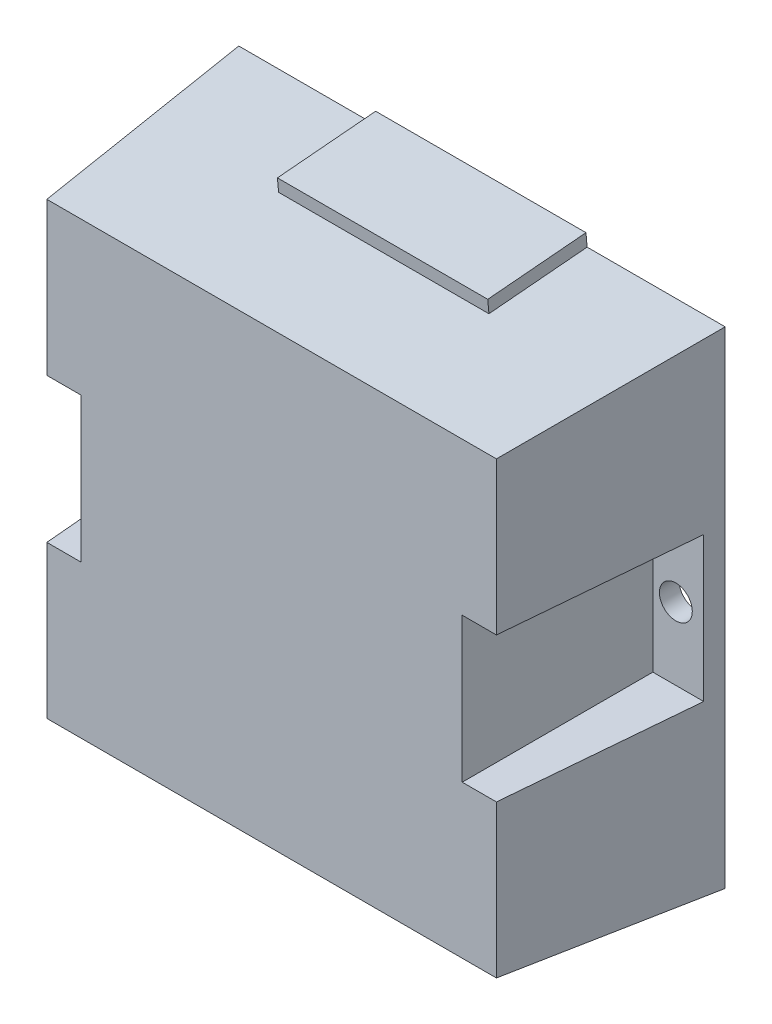
ISO-10303-21;
HEADER;
FILE_DESCRIPTION(('STEP AP214'),'2;1');
FILE_NAME('part.step','',(''),(''),'','','');
FILE_SCHEMA(('AUTOMOTIVE_DESIGN { 1 0 10303 214 1 1 1 1 }'));
ENDSEC;
DATA;
#1=APPLICATION_CONTEXT('core data for automotive mechanical design processes');
#2=APPLICATION_PROTOCOL_DEFINITION('international standard','automotive_design',2000,#1);
#3=PRODUCT_CONTEXT('',#1,'mechanical');
#4=PRODUCT('Part','Part','',(#3));
#5=PRODUCT_RELATED_PRODUCT_CATEGORY('part','',(#4));
#6=PRODUCT_DEFINITION_FORMATION('','',#4);
#7=PRODUCT_DEFINITION_CONTEXT('part definition',#1,'design');
#8=PRODUCT_DEFINITION('design','',#6,#7);
#9=PRODUCT_DEFINITION_SHAPE('','',#8);
#10=(LENGTH_UNIT() NAMED_UNIT(*) SI_UNIT(.MILLI.,.METRE.));
#11=(NAMED_UNIT(*) PLANE_ANGLE_UNIT() SI_UNIT($,.RADIAN.));
#12=(NAMED_UNIT(*) SI_UNIT($,.STERADIAN.) SOLID_ANGLE_UNIT());
#13=UNCERTAINTY_MEASURE_WITH_UNIT(LENGTH_MEASURE(1.E-05),#10,'distance_accuracy_value','');
#14=(GEOMETRIC_REPRESENTATION_CONTEXT(3) GLOBAL_UNCERTAINTY_ASSIGNED_CONTEXT((#13)) GLOBAL_UNIT_ASSIGNED_CONTEXT((#10,
#11,#12)) REPRESENTATION_CONTEXT('',''));
#15=CARTESIAN_POINT('',(0.,0.,0.));
#16=DIRECTION('',(0.,0.,1.));
#17=DIRECTION('',(1.,0.,0.));
#18=AXIS2_PLACEMENT_3D('',#15,#16,#17);
#19=CARTESIAN_POINT('',(-172.106350005706,67.682970668651,0.));
#20=DIRECTION('',(0.,0.996194698091746,0.0871557427476584));
#21=DIRECTION('',(0.,-0.0871557427476584,0.996194698091746));
#22=AXIS2_PLACEMENT_3D('',#19,#20,#21);
#23=PLANE('',#22);
#24=DIRECTION('',(0.,-0.0871557427476577,0.996194698091746));
#25=VECTOR('',#24,1.);
#26=CARTESIAN_POINT('',(-151.106350005706,67.682970668651,0.));
#27=LINE('',#26,#25);
#28=CARTESIAN_POINT('',(-151.106350005706,67.682970668651,0.));
#29=VERTEX_POINT('',#28);
#30=CARTESIAN_POINT('',(-151.106350005706,66.3756345274361,14.9429204713762));
#31=VERTEX_POINT('',#30);
#32=EDGE_CURVE('E55',#29,#31,#27,.T.);
#33=ORIENTED_EDGE('',*,*,#32,.F.);
#34=DIRECTION('',(-1.,0.,0.));
#35=VECTOR('',#34,1.);
#36=CARTESIAN_POINT('',(-172.106350005706,67.682970668651,0.));
#37=LINE('',#36,#35);
#38=CARTESIAN_POINT('',(-172.106350005706,67.682970668651,0.));
#39=VERTEX_POINT('',#38);
#40=EDGE_CURVE('E239',#29,#39,#37,.T.);
#41=ORIENTED_EDGE('',*,*,#40,.T.);
#42=DIRECTION('',(-0.0868265938642478,0.0868265938642478,-0.992432509138967));
#43=VECTOR('',#42,1.);
#44=CARTESIAN_POINT('',(-171.548474557953,67.125095220898,6.37654554624272));
#45=LINE('',#44,#43);
#46=CARTESIAN_POINT('',(-169.306712772876,64.8833334358214,32.));
#47=VERTEX_POINT('',#46);
#48=EDGE_CURVE('E261',#47,#39,#45,.T.);
#49=ORIENTED_EDGE('',*,*,#48,.F.);
#50=DIRECTION('',(1.,0.,0.));
#51=VECTOR('',#50,1.);
#52=CARTESIAN_POINT('',(0.,64.8833334358214,32.));
#53=LINE('',#52,#51);
#54=CARTESIAN_POINT('',(-100.905987238535,64.8833334358214,32.));
#55=VERTEX_POINT('',#54);
#56=EDGE_CURVE('E259',#55,#47,#53,.F.);
#57=ORIENTED_EDGE('',*,*,#56,.F.);
#58=DIRECTION('',(0.0868265938642478,0.0868265938642478,-0.992432509138967));
#59=VECTOR('',#58,1.);
#60=CARTESIAN_POINT('',(-98.6642254534586,67.125095220898,6.37654554624272));
#61=LINE('',#60,#59);
#62=CARTESIAN_POINT('',(-98.1063500057056,67.682970668651,0.));
#63=VERTEX_POINT('',#62);
#64=EDGE_CURVE('E274',#55,#63,#61,.T.);
#65=ORIENTED_EDGE('',*,*,#64,.T.);
#66=CARTESIAN_POINT('',(-119.106350005706,67.682970668651,0.));
#67=VERTEX_POINT('',#66);
#68=EDGE_CURVE('E248',#63,#67,#37,.T.);
#69=ORIENTED_EDGE('',*,*,#68,.T.);
#70=DIRECTION('',(0.,0.0871557427476577,-0.996194698091746));
#71=VECTOR('',#70,1.);
#72=CARTESIAN_POINT('',(-119.106350005706,67.682970668651,0.));
#73=LINE('',#72,#71);
#74=CARTESIAN_POINT('',(-119.106350005706,66.3756345274361,14.9429204713762));
#75=VERTEX_POINT('',#74);
#76=EDGE_CURVE('E318',#75,#67,#73,.T.);
#77=ORIENTED_EDGE('',*,*,#76,.F.);
#78=DIRECTION('',(1.,0.,0.));
#79=VECTOR('',#78,1.);
#80=CARTESIAN_POINT('',(-151.106350005706,66.3756345274361,14.9429204713762));
#81=LINE('',#80,#79);
#82=EDGE_CURVE('E50',#31,#75,#81,.T.);
#83=ORIENTED_EDGE('',*,*,#82,.F.);
#84=EDGE_LOOP('',(#33,#41,#49,#57,#65,#69,#77,#83));
#85=FACE_BOUND('',#84,.T.);
#86=ADVANCED_FACE('F33',(#85),#23,.T.);
#87=CARTESIAN_POINT('',(-172.106350005706,-6.31702933134903,0.));
#88=DIRECTION('',(-0.996194698091746,0.,0.0871557427476584));
#89=DIRECTION('',(0.0871557427476584,0.,0.996194698091746));
#90=AXIS2_PLACEMENT_3D('',#87,#88,#89);
#91=PLANE('',#90);
#92=DIRECTION('',(0.,1.,0.));
#93=VECTOR('',#92,1.);
#94=CARTESIAN_POINT('',(-171.843884015128,-6.31702933134903,3.));
#95=LINE('',#94,#93);
#96=CARTESIAN_POINT('',(-171.843884015128,41.682970668651,3.));
#97=VERTEX_POINT('',#96);
#98=CARTESIAN_POINT('',(-171.843884015128,19.682970668651,3.));
#99=VERTEX_POINT('',#98);
#100=EDGE_CURVE('E254',#97,#99,#95,.F.);
#101=ORIENTED_EDGE('',*,*,#100,.F.);
#102=DIRECTION('',(-0.0871557427476584,0.,-0.996194698091746));
#103=VECTOR('',#102,1.);
#104=CARTESIAN_POINT('',(-172.106350005706,41.682970668651,0.));
#105=LINE('',#104,#103);
#106=CARTESIAN_POINT('',(-169.306712772876,41.682970668651,32.));
#107=VERTEX_POINT('',#106);
#108=EDGE_CURVE('E229',#97,#107,#105,.F.);
#109=ORIENTED_EDGE('',*,*,#108,.T.);
#110=DIRECTION('',(0.,1.,0.));
#111=VECTOR('',#110,1.);
#112=CARTESIAN_POINT('',(-169.306712772876,0.,32.));
#113=LINE('',#112,#111);
#114=EDGE_CURVE('E268',#47,#107,#113,.F.);
#115=ORIENTED_EDGE('',*,*,#114,.F.);
#116=ORIENTED_EDGE('',*,*,#48,.T.);
#117=DIRECTION('',(0.,-1.,0.));
#118=VECTOR('',#117,1.);
#119=CARTESIAN_POINT('',(-172.106350005706,-6.31702933134903,0.));
#120=LINE('',#119,#118);
#121=CARTESIAN_POINT('',(-172.106350005706,-6.31702933134903,0.));
#122=VERTEX_POINT('',#121);
#123=EDGE_CURVE('E232',#39,#122,#120,.T.);
#124=ORIENTED_EDGE('',*,*,#123,.T.);
#125=DIRECTION('',(-0.0868265938642478,-0.0868265938642478,-0.992432509138967));
#126=VECTOR('',#125,1.);
#127=CARTESIAN_POINT('',(-172.106350005706,-6.31702933134903,0.));
#128=LINE('',#127,#126);
#129=CARTESIAN_POINT('',(-169.306712772876,-3.51739209851946,32.));
#130=VERTEX_POINT('',#129);
#131=EDGE_CURVE('E242',#130,#122,#128,.T.);
#132=ORIENTED_EDGE('',*,*,#131,.F.);
#133=CARTESIAN_POINT('',(-169.306712772876,19.682970668651,32.));
#134=VERTEX_POINT('',#133);
#135=EDGE_CURVE('E250',#134,#130,#113,.F.);
#136=ORIENTED_EDGE('',*,*,#135,.F.);
#137=DIRECTION('',(0.0871557427476584,0.,0.996194698091746));
#138=VECTOR('',#137,1.);
#139=CARTESIAN_POINT('',(-172.106350005706,19.682970668651,0.));
#140=LINE('',#139,#138);
#141=EDGE_CURVE('E224',#134,#99,#140,.F.);
#142=ORIENTED_EDGE('',*,*,#141,.T.);
#143=EDGE_LOOP('',(#101,#109,#115,#116,#124,#132,#136,#142));
#144=FACE_BOUND('',#143,.T.);
#145=ADVANCED_FACE('F282',(#144),#91,.T.);
#146=CARTESIAN_POINT('',(-172.106350005706,-6.31702933134903,0.));
#147=DIRECTION('',(0.,-0.996194698091746,0.0871557427476584));
#148=DIRECTION('',(0.,-0.0871557427476584,-0.996194698091746));
#149=AXIS2_PLACEMENT_3D('',#146,#147,#148);
#150=PLANE('',#149);
#151=DIRECTION('',(1.,0.,0.));
#152=VECTOR('',#151,1.);
#153=CARTESIAN_POINT('',(-172.106350005706,-6.31702933134903,0.));
#154=LINE('',#153,#152);
#155=CARTESIAN_POINT('',(-98.1063500057056,-6.31702933134903,0.));
#156=VERTEX_POINT('',#155);
#157=EDGE_CURVE('E235',#122,#156,#154,.T.);
#158=ORIENTED_EDGE('',*,*,#157,.T.);
#159=DIRECTION('',(0.0868265938642478,-0.0868265938642478,-0.992432509138967));
#160=VECTOR('',#159,1.);
#161=CARTESIAN_POINT('',(-98.1063500057056,-6.31702933134903,0.));
#162=LINE('',#161,#160);
#163=CARTESIAN_POINT('',(-100.905987238535,-3.51739209851946,32.));
#164=VERTEX_POINT('',#163);
#165=EDGE_CURVE('E271',#164,#156,#162,.T.);
#166=ORIENTED_EDGE('',*,*,#165,.F.);
#167=DIRECTION('',(-1.,0.,0.));
#168=VECTOR('',#167,1.);
#169=CARTESIAN_POINT('',(0.,-3.51739209851946,32.));
#170=LINE('',#169,#168);
#171=EDGE_CURVE('E266',#130,#164,#170,.F.);
#172=ORIENTED_EDGE('',*,*,#171,.F.);
#173=ORIENTED_EDGE('',*,*,#131,.T.);
#174=EDGE_LOOP('',(#158,#166,#172,#173));
#175=FACE_BOUND('',#174,.T.);
#176=ADVANCED_FACE('F35',(#175),#150,.T.);
#177=CARTESIAN_POINT('',(-98.1063500057056,-6.31702933134903,0.));
#178=DIRECTION('',(0.996194698091746,0.,0.0871557427476584));
#179=DIRECTION('',(0.0871557427476584,0.,-0.996194698091746));
#180=AXIS2_PLACEMENT_3D('',#177,#178,#179);
#181=PLANE('',#180);
#182=DIRECTION('',(0.,-1.,0.));
#183=VECTOR('',#182,1.);
#184=CARTESIAN_POINT('',(-100.905987238535,0.,32.));
#185=LINE('',#184,#183);
#186=CARTESIAN_POINT('',(-100.905987238535,41.682970668651,32.));
#187=VERTEX_POINT('',#186);
#188=EDGE_CURVE('E265',#187,#55,#185,.F.);
#189=ORIENTED_EDGE('',*,*,#188,.F.);
#190=DIRECTION('',(-0.0871557427476584,0.,0.996194698091746));
#191=VECTOR('',#190,1.);
#192=CARTESIAN_POINT('',(-98.1063500057056,41.682970668651,0.));
#193=LINE('',#192,#191);
#194=CARTESIAN_POINT('',(-98.3688159962834,41.682970668651,3.));
#195=VERTEX_POINT('',#194);
#196=EDGE_CURVE('E205',#187,#195,#193,.F.);
#197=ORIENTED_EDGE('',*,*,#196,.T.);
#198=DIRECTION('',(0.,-1.,0.));
#199=VECTOR('',#198,1.);
#200=CARTESIAN_POINT('',(-98.3688159962834,-6.31702933134903,3.));
#201=LINE('',#200,#199);
#202=CARTESIAN_POINT('',(-98.3688159962834,19.682970668651,3.));
#203=VERTEX_POINT('',#202);
#204=EDGE_CURVE('E11',#203,#195,#201,.F.);
#205=ORIENTED_EDGE('',*,*,#204,.F.);
#206=DIRECTION('',(0.0871557427476584,0.,-0.996194698091746));
#207=VECTOR('',#206,1.);
#208=CARTESIAN_POINT('',(-98.1063500057056,19.682970668651,0.));
#209=LINE('',#208,#207);
#210=CARTESIAN_POINT('',(-100.905987238535,19.682970668651,32.));
#211=VERTEX_POINT('',#210);
#212=EDGE_CURVE('E200',#203,#211,#209,.F.);
#213=ORIENTED_EDGE('',*,*,#212,.T.);
#214=EDGE_CURVE('E262',#164,#211,#185,.F.);
#215=ORIENTED_EDGE('',*,*,#214,.F.);
#216=ORIENTED_EDGE('',*,*,#165,.T.);
#217=DIRECTION('',(0.,1.,0.));
#218=VECTOR('',#217,1.);
#219=CARTESIAN_POINT('',(-98.1063500057056,-6.31702933134903,0.));
#220=LINE('',#219,#218);
#221=EDGE_CURVE('E237',#156,#63,#220,.T.);
#222=ORIENTED_EDGE('',*,*,#221,.T.);
#223=ORIENTED_EDGE('',*,*,#64,.F.);
#224=EDGE_LOOP('',(#189,#197,#205,#213,#215,#216,#222,#223));
#225=FACE_BOUND('',#224,.T.);
#226=ADVANCED_FACE('F352',(#225),#181,.T.);
#227=CARTESIAN_POINT('',(0.,0.,32.));
#228=DIRECTION('',(0.,0.,-1.));
#229=DIRECTION('',(-1.,0.,0.));
#230=AXIS2_PLACEMENT_3D('',#227,#228,#229);
#231=PLANE('',#230);
#232=DIRECTION('',(0.,-1.,0.));
#233=VECTOR('',#232,1.);
#234=CARTESIAN_POINT('',(-106.106350005706,41.682970668651,32.));
#235=LINE('',#234,#233);
#236=CARTESIAN_POINT('',(-106.106350005706,41.682970668651,32.));
#237=VERTEX_POINT('',#236);
#238=CARTESIAN_POINT('',(-106.106350005706,19.682970668651,32.));
#239=VERTEX_POINT('',#238);
#240=EDGE_CURVE('E184',#237,#239,#235,.T.);
#241=ORIENTED_EDGE('',*,*,#240,.F.);
#242=DIRECTION('',(1.,0.,0.));
#243=VECTOR('',#242,1.);
#244=CARTESIAN_POINT('',(0.,41.682970668651,32.));
#245=LINE('',#244,#243);
#246=EDGE_CURVE('E42',#237,#187,#245,.T.);
#247=ORIENTED_EDGE('',*,*,#246,.T.);
#248=ORIENTED_EDGE('',*,*,#188,.T.);
#249=ORIENTED_EDGE('',*,*,#56,.T.);
#250=ORIENTED_EDGE('',*,*,#114,.T.);
#251=DIRECTION('',(-1.,0.,0.));
#252=VECTOR('',#251,1.);
#253=CARTESIAN_POINT('',(-184.049060048836,41.682970668651,32.));
#254=LINE('',#253,#252);
#255=CARTESIAN_POINT('',(-164.106350005706,41.682970668651,32.));
#256=VERTEX_POINT('',#255);
#257=EDGE_CURVE('E212',#256,#107,#254,.T.);
#258=ORIENTED_EDGE('',*,*,#257,.F.);
#259=DIRECTION('',(0.,1.,0.));
#260=VECTOR('',#259,1.);
#261=CARTESIAN_POINT('',(-164.106350005706,41.682970668651,32.));
#262=LINE('',#261,#260);
#263=CARTESIAN_POINT('',(-164.106350005706,19.682970668651,32.));
#264=VERTEX_POINT('',#263);
#265=EDGE_CURVE('E208',#264,#256,#262,.T.);
#266=ORIENTED_EDGE('',*,*,#265,.F.);
#267=DIRECTION('',(-1.,0.,0.));
#268=VECTOR('',#267,1.);
#269=CARTESIAN_POINT('',(0.,19.682970668651,32.));
#270=LINE('',#269,#268);
#271=EDGE_CURVE('E256',#264,#134,#270,.T.);
#272=ORIENTED_EDGE('',*,*,#271,.T.);
#273=ORIENTED_EDGE('',*,*,#135,.T.);
#274=ORIENTED_EDGE('',*,*,#171,.T.);
#275=ORIENTED_EDGE('',*,*,#214,.T.);
#276=DIRECTION('',(1.,0.,0.));
#277=VECTOR('',#276,1.);
#278=CARTESIAN_POINT('',(-106.106350005706,19.682970668651,32.));
#279=LINE('',#278,#277);
#280=EDGE_CURVE('E189',#239,#211,#279,.T.);
#281=ORIENTED_EDGE('',*,*,#280,.F.);
#282=EDGE_LOOP('',(#241,#247,#248,#249,#250,#258,#266,#272,#273,#274,#275,#281));
#283=FACE_BOUND('',#282,.T.);
#284=ADVANCED_FACE('F297',(#283),#231,.F.);
#285=CARTESIAN_POINT('',(0.,0.,0.));
#286=DIRECTION('',(0.,0.,-1.));
#287=DIRECTION('',(-1.,0.,0.));
#288=AXIS2_PLACEMENT_3D('',#285,#286,#287);
#289=PLANE('',#288);
#290=CARTESIAN_POINT('',(-102.606350005706,30.682970668651,0.));
#291=DIRECTION('',(0.,0.,-1.));
#292=DIRECTION('',(-1.,0.,0.));
#293=AXIS2_PLACEMENT_3D('',#290,#291,#292);
#294=CIRCLE('',#293,2.50000000000001);
#295=CARTESIAN_POINT('',(-105.106350005706,30.682970668651,0.));
#296=VERTEX_POINT('',#295);
#297=EDGE_CURVE('E170',#296,#296,#294,.T.);
#298=ORIENTED_EDGE('',*,*,#297,.F.);
#299=EDGE_LOOP('',(#298));
#300=FACE_BOUND('',#299,.T.);
#301=CARTESIAN_POINT('',(-167.606350005706,30.682970668651,0.));
#302=DIRECTION('',(0.,0.,-1.));
#303=DIRECTION('',(-1.,0.,0.));
#304=AXIS2_PLACEMENT_3D('',#301,#302,#303);
#305=CIRCLE('',#304,2.5);
#306=CARTESIAN_POINT('',(-170.106350005706,30.682970668651,0.));
#307=VERTEX_POINT('',#306);
#308=EDGE_CURVE('E181',#307,#307,#305,.T.);
#309=ORIENTED_EDGE('',*,*,#308,.F.);
#310=EDGE_LOOP('',(#309));
#311=FACE_BOUND('',#310,.T.);
#312=ORIENTED_EDGE('',*,*,#123,.F.);
#313=ORIENTED_EDGE('',*,*,#40,.F.);
#314=DIRECTION('',(-1.,0.,0.));
#315=VECTOR('',#314,1.);
#316=CARTESIAN_POINT('',(-151.106350005706,67.682970668651,0.));
#317=LINE('',#316,#315);
#318=EDGE_CURVE('E164',#67,#29,#317,.T.);
#319=ORIENTED_EDGE('',*,*,#318,.F.);
#320=ORIENTED_EDGE('',*,*,#68,.F.);
#321=ORIENTED_EDGE('',*,*,#221,.F.);
#322=ORIENTED_EDGE('',*,*,#157,.F.);
#323=EDGE_LOOP('',(#312,#313,#319,#320,#321,#322));
#324=FACE_BOUND('',#323,.T.);
#325=ADVANCED_FACE('F286',(#300,#311,#324),#289,.T.);
#326=CARTESIAN_POINT('',(0.,0.,3.));
#327=DIRECTION('',(0.,0.,1.));
#328=DIRECTION('',(1.,0.,0.));
#329=AXIS2_PLACEMENT_3D('',#326,#327,#328);
#330=PLANE('',#329);
#331=CARTESIAN_POINT('',(-167.606350005706,30.682970668651,3.));
#332=DIRECTION('',(0.,0.,1.));
#333=DIRECTION('',(1.,0.,0.));
#334=AXIS2_PLACEMENT_3D('',#331,#332,#333);
#335=CIRCLE('',#334,2.5);
#336=CARTESIAN_POINT('',(-165.106350005706,30.682970668651,3.));
#337=VERTEX_POINT('',#336);
#338=EDGE_CURVE('E178',#337,#337,#335,.T.);
#339=ORIENTED_EDGE('',*,*,#338,.F.);
#340=EDGE_LOOP('',(#339));
#341=FACE_BOUND('',#340,.T.);
#342=ORIENTED_EDGE('',*,*,#100,.T.);
#343=DIRECTION('',(1.,0.,0.));
#344=VECTOR('',#343,1.);
#345=CARTESIAN_POINT('',(-184.049060048836,19.682970668651,3.));
#346=LINE('',#345,#344);
#347=CARTESIAN_POINT('',(-164.106350005706,19.682970668651,3.));
#348=VERTEX_POINT('',#347);
#349=EDGE_CURVE('E209',#99,#348,#346,.T.);
#350=ORIENTED_EDGE('',*,*,#349,.T.);
#351=DIRECTION('',(0.,1.,0.));
#352=VECTOR('',#351,1.);
#353=CARTESIAN_POINT('',(-164.106350005706,41.682970668651,3.));
#354=LINE('',#353,#352);
#355=CARTESIAN_POINT('',(-164.106350005706,41.682970668651,3.));
#356=VERTEX_POINT('',#355);
#357=EDGE_CURVE('E211',#348,#356,#354,.T.);
#358=ORIENTED_EDGE('',*,*,#357,.T.);
#359=DIRECTION('',(-1.,0.,0.));
#360=VECTOR('',#359,1.);
#361=CARTESIAN_POINT('',(-184.049060048836,41.682970668651,3.));
#362=LINE('',#361,#360);
#363=EDGE_CURVE('E215',#356,#97,#362,.T.);
#364=ORIENTED_EDGE('',*,*,#363,.T.);
#365=EDGE_LOOP('',(#342,#350,#358,#364));
#366=FACE_BOUND('',#365,.T.);
#367=ADVANCED_FACE('F309',(#341,#366),#330,.T.);
#368=CARTESIAN_POINT('',(-184.049060048836,41.682970668651,3.));
#369=DIRECTION('',(0.,1.,0.));
#370=DIRECTION('',(0.,0.,1.));
#371=AXIS2_PLACEMENT_3D('',#368,#369,#370);
#372=PLANE('',#371);
#373=ORIENTED_EDGE('',*,*,#363,.F.);
#374=DIRECTION('',(0.,0.,1.));
#375=VECTOR('',#374,1.);
#376=CARTESIAN_POINT('',(-164.106350005706,41.682970668651,3.));
#377=LINE('',#376,#375);
#378=EDGE_CURVE('E222',#356,#256,#377,.T.);
#379=ORIENTED_EDGE('',*,*,#378,.T.);
#380=ORIENTED_EDGE('',*,*,#257,.T.);
#381=ORIENTED_EDGE('',*,*,#108,.F.);
#382=EDGE_LOOP('',(#373,#379,#380,#381));
#383=FACE_BOUND('',#382,.T.);
#384=ADVANCED_FACE('F311',(#383),#372,.F.);
#385=CARTESIAN_POINT('',(-184.049060048836,19.682970668651,3.));
#386=DIRECTION('',(0.,-1.,0.));
#387=DIRECTION('',(0.,0.,-1.));
#388=AXIS2_PLACEMENT_3D('',#385,#386,#387);
#389=PLANE('',#388);
#390=ORIENTED_EDGE('',*,*,#271,.F.);
#391=DIRECTION('',(0.,0.,1.));
#392=VECTOR('',#391,1.);
#393=CARTESIAN_POINT('',(-164.106350005706,19.682970668651,3.));
#394=LINE('',#393,#392);
#395=EDGE_CURVE('E218',#348,#264,#394,.T.);
#396=ORIENTED_EDGE('',*,*,#395,.F.);
#397=ORIENTED_EDGE('',*,*,#349,.F.);
#398=ORIENTED_EDGE('',*,*,#141,.F.);
#399=EDGE_LOOP('',(#390,#396,#397,#398));
#400=FACE_BOUND('',#399,.T.);
#401=ADVANCED_FACE('F302',(#400),#389,.F.);
#402=CARTESIAN_POINT('',(-164.106350005706,41.682970668651,3.));
#403=DIRECTION('',(1.,0.,0.));
#404=DIRECTION('',(0.,0.,-1.));
#405=AXIS2_PLACEMENT_3D('',#402,#403,#404);
#406=PLANE('',#405);
#407=ORIENTED_EDGE('',*,*,#265,.T.);
#408=ORIENTED_EDGE('',*,*,#378,.F.);
#409=ORIENTED_EDGE('',*,*,#357,.F.);
#410=ORIENTED_EDGE('',*,*,#395,.T.);
#411=EDGE_LOOP('',(#407,#408,#409,#410));
#412=FACE_BOUND('',#411,.T.);
#413=ADVANCED_FACE('F306',(#412),#406,.F.);
#414=CARTESIAN_POINT('',(0.,0.,3.));
#415=DIRECTION('',(0.,0.,1.));
#416=DIRECTION('',(1.,0.,0.));
#417=AXIS2_PLACEMENT_3D('',#414,#415,#416);
#418=PLANE('',#417);
#419=CARTESIAN_POINT('',(-102.606350005706,30.682970668651,3.));
#420=DIRECTION('',(0.,0.,1.));
#421=DIRECTION('',(1.,0.,0.));
#422=AXIS2_PLACEMENT_3D('',#419,#420,#421);
#423=CIRCLE('',#422,2.50000000000001);
#424=CARTESIAN_POINT('',(-100.106350005706,30.682970668651,3.));
#425=VERTEX_POINT('',#424);
#426=EDGE_CURVE('E167',#425,#425,#423,.T.);
#427=ORIENTED_EDGE('',*,*,#426,.F.);
#428=EDGE_LOOP('',(#427));
#429=FACE_BOUND('',#428,.T.);
#430=ORIENTED_EDGE('',*,*,#204,.T.);
#431=DIRECTION('',(-1.,0.,0.));
#432=VECTOR('',#431,1.);
#433=CARTESIAN_POINT('',(-106.106350005706,41.682970668651,3.));
#434=LINE('',#433,#432);
#435=CARTESIAN_POINT('',(-106.106350005706,41.682970668651,3.));
#436=VERTEX_POINT('',#435);
#437=EDGE_CURVE('E192',#195,#436,#434,.T.);
#438=ORIENTED_EDGE('',*,*,#437,.T.);
#439=DIRECTION('',(0.,-1.,0.));
#440=VECTOR('',#439,1.);
#441=CARTESIAN_POINT('',(-106.106350005706,41.682970668651,3.));
#442=LINE('',#441,#440);
#443=CARTESIAN_POINT('',(-106.106350005706,19.682970668651,3.));
#444=VERTEX_POINT('',#443);
#445=EDGE_CURVE('E185',#436,#444,#442,.T.);
#446=ORIENTED_EDGE('',*,*,#445,.T.);
#447=DIRECTION('',(1.,0.,0.));
#448=VECTOR('',#447,1.);
#449=CARTESIAN_POINT('',(-106.106350005706,19.682970668651,3.));
#450=LINE('',#449,#448);
#451=EDGE_CURVE('E188',#444,#203,#450,.T.);
#452=ORIENTED_EDGE('',*,*,#451,.T.);
#453=EDGE_LOOP('',(#430,#438,#446,#452));
#454=FACE_BOUND('',#453,.T.);
#455=ADVANCED_FACE('F372',(#429,#454),#418,.T.);
#456=CARTESIAN_POINT('',(-106.106350005706,41.682970668651,3.));
#457=DIRECTION('',(0.,1.,0.));
#458=DIRECTION('',(0.,0.,1.));
#459=AXIS2_PLACEMENT_3D('',#456,#457,#458);
#460=PLANE('',#459);
#461=ORIENTED_EDGE('',*,*,#246,.F.);
#462=DIRECTION('',(0.,0.,1.));
#463=VECTOR('',#462,1.);
#464=CARTESIAN_POINT('',(-106.106350005706,41.682970668651,3.));
#465=LINE('',#464,#463);
#466=EDGE_CURVE('E197',#436,#237,#465,.T.);
#467=ORIENTED_EDGE('',*,*,#466,.F.);
#468=ORIENTED_EDGE('',*,*,#437,.F.);
#469=ORIENTED_EDGE('',*,*,#196,.F.);
#470=EDGE_LOOP('',(#461,#467,#468,#469));
#471=FACE_BOUND('',#470,.T.);
#472=ADVANCED_FACE('F362',(#471),#460,.F.);
#473=CARTESIAN_POINT('',(-106.106350005706,19.682970668651,3.));
#474=DIRECTION('',(0.,-1.,0.));
#475=DIRECTION('',(0.,0.,-1.));
#476=AXIS2_PLACEMENT_3D('',#473,#474,#475);
#477=PLANE('',#476);
#478=ORIENTED_EDGE('',*,*,#451,.F.);
#479=DIRECTION('',(0.,0.,1.));
#480=VECTOR('',#479,1.);
#481=CARTESIAN_POINT('',(-106.106350005706,19.682970668651,3.));
#482=LINE('',#481,#480);
#483=EDGE_CURVE('E194',#444,#239,#482,.T.);
#484=ORIENTED_EDGE('',*,*,#483,.T.);
#485=ORIENTED_EDGE('',*,*,#280,.T.);
#486=ORIENTED_EDGE('',*,*,#212,.F.);
#487=EDGE_LOOP('',(#478,#484,#485,#486));
#488=FACE_BOUND('',#487,.T.);
#489=ADVANCED_FACE('F370',(#488),#477,.F.);
#490=CARTESIAN_POINT('',(-106.106350005706,41.682970668651,3.));
#491=DIRECTION('',(-1.,0.,0.));
#492=DIRECTION('',(0.,0.,1.));
#493=AXIS2_PLACEMENT_3D('',#490,#491,#492);
#494=PLANE('',#493);
#495=ORIENTED_EDGE('',*,*,#240,.T.);
#496=ORIENTED_EDGE('',*,*,#483,.F.);
#497=ORIENTED_EDGE('',*,*,#445,.F.);
#498=ORIENTED_EDGE('',*,*,#466,.T.);
#499=EDGE_LOOP('',(#495,#496,#497,#498));
#500=FACE_BOUND('',#499,.T.);
#501=ADVANCED_FACE('F366',(#500),#494,.F.);
#502=CARTESIAN_POINT('',(-167.606350005706,30.682970668651,-7.));
#503=DIRECTION('',(0.,0.,1.));
#504=DIRECTION('',(1.,0.,0.));
#505=AXIS2_PLACEMENT_3D('',#502,#503,#504);
#506=CYLINDRICAL_SURFACE('',#505,2.5);
#507=ORIENTED_EDGE('',*,*,#308,.T.);
#508=EDGE_LOOP('',(#507));
#509=FACE_BOUND('',#508,.T.);
#510=ORIENTED_EDGE('',*,*,#338,.T.);
#511=EDGE_LOOP('',(#510));
#512=FACE_BOUND('',#511,.T.);
#513=ADVANCED_FACE('F384',(#509,#512),#506,.F.);
#514=CARTESIAN_POINT('',(-102.606350005706,30.682970668651,-7.));
#515=DIRECTION('',(0.,0.,1.));
#516=DIRECTION('',(1.,0.,0.));
#517=AXIS2_PLACEMENT_3D('',#514,#515,#516);
#518=CYLINDRICAL_SURFACE('',#517,2.50000000000001);
#519=ORIENTED_EDGE('',*,*,#297,.T.);
#520=EDGE_LOOP('',(#519));
#521=FACE_BOUND('',#520,.T.);
#522=ORIENTED_EDGE('',*,*,#426,.T.);
#523=EDGE_LOOP('',(#522));
#524=FACE_BOUND('',#523,.T.);
#525=ADVANCED_FACE('F407',(#521,#524),#518,.F.);
#526=CARTESIAN_POINT('',(-151.106350005706,69.6753600648345,0.174311485495318));
#527=DIRECTION('',(1.,0.,0.));
#528=DIRECTION('',(0.,0.,-1.));
#529=AXIS2_PLACEMENT_3D('',#526,#527,#528);
#530=PLANE('',#529);
#531=ORIENTED_EDGE('',*,*,#32,.T.);
#532=DIRECTION('',(0.,-0.996194698091746,-0.0871557427476584));
#533=VECTOR('',#532,1.);
#534=CARTESIAN_POINT('',(-151.106350005706,68.3680239236196,15.1172319568715));
#535=LINE('',#534,#533);
#536=CARTESIAN_POINT('',(-151.106350005706,68.3680239236196,15.1172319568715));
#537=VERTEX_POINT('',#536);
#538=EDGE_CURVE('E149',#537,#31,#535,.T.);
#539=ORIENTED_EDGE('',*,*,#538,.F.);
#540=DIRECTION('',(0.,-0.0871557427476577,0.996194698091746));
#541=VECTOR('',#540,1.);
#542=CARTESIAN_POINT('',(-151.106350005706,69.6753600648345,0.174311485495318));
#543=LINE('',#542,#541);
#544=CARTESIAN_POINT('',(-151.106350005706,69.6753600648345,0.174311485495318));
#545=VERTEX_POINT('',#544);
#546=EDGE_CURVE('E155',#545,#537,#543,.T.);
#547=ORIENTED_EDGE('',*,*,#546,.F.);
#548=DIRECTION('',(0.,-0.996194698091746,-0.0871557427476584));
#549=VECTOR('',#548,1.);
#550=CARTESIAN_POINT('',(-151.106350005706,69.6753600648345,0.174311485495318));
#551=LINE('',#550,#549);
#552=EDGE_CURVE('E326',#545,#29,#551,.T.);
#553=ORIENTED_EDGE('',*,*,#552,.T.);
#554=EDGE_LOOP('',(#531,#539,#547,#553));
#555=FACE_BOUND('',#554,.T.);
#556=ADVANCED_FACE('F166',(#555),#530,.F.);
#557=CARTESIAN_POINT('',(-151.106350005706,68.3680239236196,15.1172319568715));
#558=DIRECTION('',(0.,0.0871557427476584,-0.996194698091746));
#559=DIRECTION('',(0.,0.996194698091746,0.0871557427476584));
#560=AXIS2_PLACEMENT_3D('',#557,#558,#559);
#561=PLANE('',#560);
#562=ORIENTED_EDGE('',*,*,#82,.T.);
#563=DIRECTION('',(0.,-0.996194698091746,-0.0871557427476584));
#564=VECTOR('',#563,1.);
#565=CARTESIAN_POINT('',(-119.106350005706,68.3680239236196,15.1172319568715));
#566=LINE('',#565,#564);
#567=CARTESIAN_POINT('',(-119.106350005706,68.3680239236196,15.1172319568715));
#568=VERTEX_POINT('',#567);
#569=EDGE_CURVE('E151',#568,#75,#566,.T.);
#570=ORIENTED_EDGE('',*,*,#569,.F.);
#571=DIRECTION('',(1.,0.,0.));
#572=VECTOR('',#571,1.);
#573=CARTESIAN_POINT('',(-151.106350005706,68.3680239236196,15.1172319568715));
#574=LINE('',#573,#572);
#575=EDGE_CURVE('E145',#537,#568,#574,.T.);
#576=ORIENTED_EDGE('',*,*,#575,.F.);
#577=ORIENTED_EDGE('',*,*,#538,.T.);
#578=EDGE_LOOP('',(#562,#570,#576,#577));
#579=FACE_BOUND('',#578,.T.);
#580=ADVANCED_FACE('F147',(#579),#561,.F.);
#581=CARTESIAN_POINT('',(-119.106350005706,69.6753600648345,0.174311485495318));
#582=DIRECTION('',(-1.,0.,0.));
#583=DIRECTION('',(0.,0.,1.));
#584=AXIS2_PLACEMENT_3D('',#581,#582,#583);
#585=PLANE('',#584);
#586=ORIENTED_EDGE('',*,*,#76,.T.);
#587=DIRECTION('',(0.,-0.996194698091746,-0.0871557427476584));
#588=VECTOR('',#587,1.);
#589=CARTESIAN_POINT('',(-119.106350005706,69.6753600648345,0.174311485495318));
#590=LINE('',#589,#588);
#591=CARTESIAN_POINT('',(-119.106350005706,69.6753600648345,0.174311485495318));
#592=VERTEX_POINT('',#591);
#593=EDGE_CURVE('E172',#592,#67,#590,.T.);
#594=ORIENTED_EDGE('',*,*,#593,.F.);
#595=DIRECTION('',(0.,0.0871557427476577,-0.996194698091746));
#596=VECTOR('',#595,1.);
#597=CARTESIAN_POINT('',(-119.106350005706,69.6753600648345,0.174311485495318));
#598=LINE('',#597,#596);
#599=EDGE_CURVE('E154',#568,#592,#598,.T.);
#600=ORIENTED_EDGE('',*,*,#599,.F.);
#601=ORIENTED_EDGE('',*,*,#569,.T.);
#602=EDGE_LOOP('',(#586,#594,#600,#601));
#603=FACE_BOUND('',#602,.T.);
#604=ADVANCED_FACE('F335',(#603),#585,.F.);
#605=CARTESIAN_POINT('',(-151.106350005706,69.6753600648345,0.174311485495318));
#606=DIRECTION('',(0.,-0.0871557427476584,0.996194698091746));
#607=DIRECTION('',(0.,-0.996194698091746,-0.0871557427476584));
#608=AXIS2_PLACEMENT_3D('',#605,#606,#607);
#609=PLANE('',#608);
#610=ORIENTED_EDGE('',*,*,#318,.T.);
#611=ORIENTED_EDGE('',*,*,#552,.F.);
#612=DIRECTION('',(-1.,0.,0.));
#613=VECTOR('',#612,1.);
#614=CARTESIAN_POINT('',(-151.106350005706,69.6753600648345,0.174311485495318));
#615=LINE('',#614,#613);
#616=EDGE_CURVE('E160',#592,#545,#615,.T.);
#617=ORIENTED_EDGE('',*,*,#616,.F.);
#618=ORIENTED_EDGE('',*,*,#593,.T.);
#619=EDGE_LOOP('',(#610,#611,#617,#618));
#620=FACE_BOUND('',#619,.T.);
#621=ADVANCED_FACE('F336',(#620),#609,.F.);
#622=CARTESIAN_POINT('',(0.,69.1612318612017,6.05082374334305));
#623=DIRECTION('',(0.,0.996194698091746,0.0871557427476577));
#624=DIRECTION('',(0.,-0.0871557427476577,0.996194698091746));
#625=AXIS2_PLACEMENT_3D('',#622,#623,#624);
#626=PLANE('',#625);
#627=ORIENTED_EDGE('',*,*,#546,.T.);
#628=ORIENTED_EDGE('',*,*,#575,.T.);
#629=ORIENTED_EDGE('',*,*,#599,.T.);
#630=ORIENTED_EDGE('',*,*,#616,.T.);
#631=EDGE_LOOP('',(#627,#628,#629,#630));
#632=FACE_BOUND('',#631,.T.);
#633=ADVANCED_FACE('F158',(#632),#626,.T.);
#634=CLOSED_SHELL('',(#86,#145,#176,#226,#284,#325,#367,#384,#401,#413,#455,#472,#489,#501,#513,
#525,#556,#580,#604,#621,#633));
#635=MANIFOLD_SOLID_BREP('B2',#634);
#636=ADVANCED_BREP_SHAPE_REPRESENTATION('',(#18,#635),#14);
#637=SHAPE_DEFINITION_REPRESENTATION(#9,#636);
ENDSEC;
END-ISO-10303-21;
